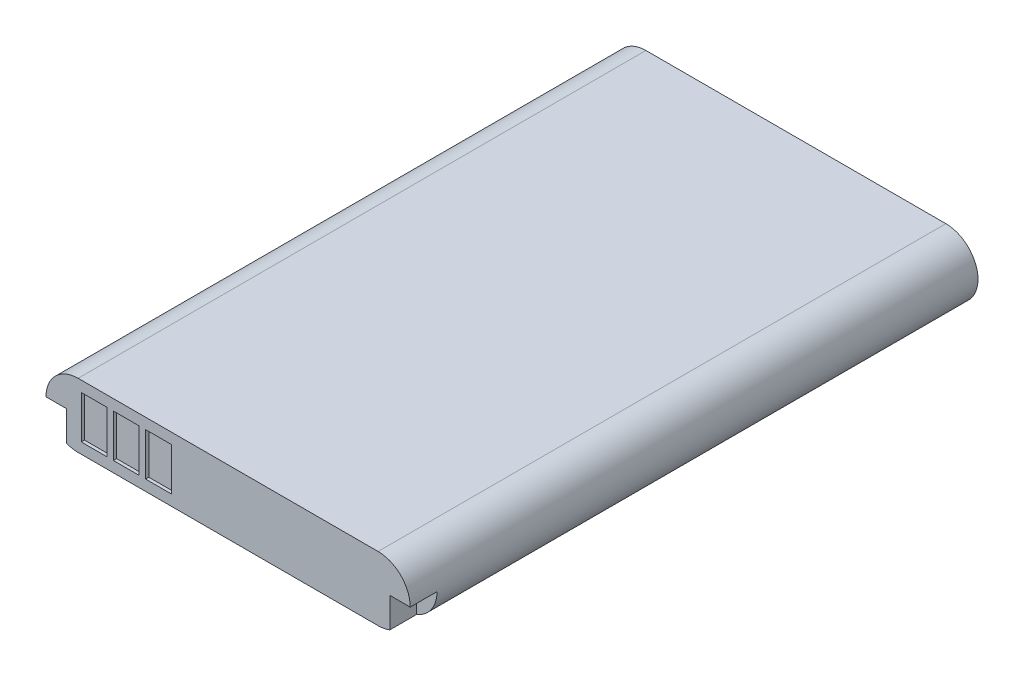
ISO-10303-21;
HEADER;
FILE_DESCRIPTION(('STEP AP214'),'2;1');
FILE_NAME('part.step','',(''),(''),'','','');
FILE_SCHEMA(('AUTOMOTIVE_DESIGN { 1 0 10303 214 1 1 1 1 }'));
ENDSEC;
DATA;
#1=APPLICATION_CONTEXT('core data for automotive mechanical design processes');
#2=APPLICATION_PROTOCOL_DEFINITION('international standard','automotive_design',2000,#1);
#3=PRODUCT_CONTEXT('',#1,'mechanical');
#4=PRODUCT('Part','Part','',(#3));
#5=PRODUCT_RELATED_PRODUCT_CATEGORY('part','',(#4));
#6=PRODUCT_DEFINITION_FORMATION('','',#4);
#7=PRODUCT_DEFINITION_CONTEXT('part definition',#1,'design');
#8=PRODUCT_DEFINITION('design','',#6,#7);
#9=PRODUCT_DEFINITION_SHAPE('','',#8);
#10=(LENGTH_UNIT() NAMED_UNIT(*) SI_UNIT(.MILLI.,.METRE.));
#11=(NAMED_UNIT(*) PLANE_ANGLE_UNIT() SI_UNIT($,.RADIAN.));
#12=(NAMED_UNIT(*) SI_UNIT($,.STERADIAN.) SOLID_ANGLE_UNIT());
#13=UNCERTAINTY_MEASURE_WITH_UNIT(LENGTH_MEASURE(1.E-05),#10,'distance_accuracy_value','');
#14=(GEOMETRIC_REPRESENTATION_CONTEXT(3) GLOBAL_UNCERTAINTY_ASSIGNED_CONTEXT((#13)) GLOBAL_UNIT_ASSIGNED_CONTEXT((#10,
#11,#12)) REPRESENTATION_CONTEXT('',''));
#15=CARTESIAN_POINT('',(0.,0.,0.));
#16=DIRECTION('',(0.,0.,1.));
#17=DIRECTION('',(1.,0.,0.));
#18=AXIS2_PLACEMENT_3D('',#15,#16,#17);
#19=CARTESIAN_POINT('',(-14.,0.,53.));
#20=DIRECTION('',(0.,0.,-1.));
#21=DIRECTION('',(-1.,0.,0.));
#22=AXIS2_PLACEMENT_3D('',#19,#20,#21);
#23=CYLINDRICAL_SURFACE('',#22,3.);
#24=CARTESIAN_POINT('',(-14.,0.,50.5));
#25=DIRECTION('',(0.,0.,1.));
#26=DIRECTION('',(1.,0.,0.));
#27=AXIS2_PLACEMENT_3D('',#24,#25,#26);
#28=CIRCLE('',#27,3.);
#29=CARTESIAN_POINT('',(-17.,0.,50.5));
#30=VERTEX_POINT('',#29);
#31=CARTESIAN_POINT('',(-15.1,-2.79105714739057,50.5));
#32=VERTEX_POINT('',#31);
#33=EDGE_CURVE('E349',#30,#32,#28,.T.);
#34=ORIENTED_EDGE('',*,*,#33,.F.);
#35=DIRECTION('',(0.,0.,-1.));
#36=VECTOR('',#35,1.);
#37=CARTESIAN_POINT('',(-17.,0.,53.));
#38=LINE('',#37,#36);
#39=CARTESIAN_POINT('',(-17.,0.,53.));
#40=VERTEX_POINT('',#39);
#41=EDGE_CURVE('E215',#30,#40,#38,.F.);
#42=ORIENTED_EDGE('',*,*,#41,.T.);
#43=CARTESIAN_POINT('',(-14.,0.,53.));
#44=DIRECTION('',(0.,0.,1.));
#45=DIRECTION('',(1.,0.,0.));
#46=AXIS2_PLACEMENT_3D('',#43,#44,#45);
#47=CIRCLE('',#46,3.);
#48=CARTESIAN_POINT('',(-14.,3.,53.));
#49=VERTEX_POINT('',#48);
#50=EDGE_CURVE('E315',#49,#40,#47,.T.);
#51=ORIENTED_EDGE('',*,*,#50,.F.);
#52=DIRECTION('',(0.,0.,-1.));
#53=VECTOR('',#52,1.);
#54=CARTESIAN_POINT('',(-14.,3.,53.));
#55=LINE('',#54,#53);
#56=CARTESIAN_POINT('',(-14.,3.,0.));
#57=VERTEX_POINT('',#56);
#58=EDGE_CURVE('E327',#49,#57,#55,.T.);
#59=ORIENTED_EDGE('',*,*,#58,.T.);
#60=CARTESIAN_POINT('',(-14.,0.,0.));
#61=DIRECTION('',(0.,0.,1.));
#62=DIRECTION('',(1.,0.,0.));
#63=AXIS2_PLACEMENT_3D('',#60,#61,#62);
#64=CIRCLE('',#63,3.);
#65=CARTESIAN_POINT('',(-14.,-3.,0.));
#66=VERTEX_POINT('',#65);
#67=EDGE_CURVE('E308',#57,#66,#64,.T.);
#68=ORIENTED_EDGE('',*,*,#67,.T.);
#69=DIRECTION('',(0.,0.,-1.));
#70=VECTOR('',#69,1.);
#71=CARTESIAN_POINT('',(-14.,-3.,53.));
#72=LINE('',#71,#70);
#73=CARTESIAN_POINT('',(-14.,-3.,53.));
#74=VERTEX_POINT('',#73);
#75=EDGE_CURVE('E344',#74,#66,#72,.T.);
#76=ORIENTED_EDGE('',*,*,#75,.F.);
#77=CARTESIAN_POINT('',(-15.1,-2.79105714739057,53.));
#78=VERTEX_POINT('',#77);
#79=EDGE_CURVE('E319',#78,#74,#47,.T.);
#80=ORIENTED_EDGE('',*,*,#79,.F.);
#81=DIRECTION('',(0.,0.,-1.));
#82=VECTOR('',#81,1.);
#83=CARTESIAN_POINT('',(-15.1,-2.79105714739057,53.));
#84=LINE('',#83,#82);
#85=EDGE_CURVE('E56',#78,#32,#84,.T.);
#86=ORIENTED_EDGE('',*,*,#85,.T.);
#87=EDGE_LOOP('',(#34,#42,#51,#59,#68,#76,#80,#86));
#88=FACE_BOUND('',#87,.T.);
#89=ADVANCED_FACE('F34',(#88),#23,.T.);
#90=CARTESIAN_POINT('',(-14.,-3.,53.));
#91=DIRECTION('',(0.,1.,0.));
#92=DIRECTION('',(0.,0.,1.));
#93=AXIS2_PLACEMENT_3D('',#90,#91,#92);
#94=PLANE('',#93);
#95=DIRECTION('',(1.,0.,0.));
#96=VECTOR('',#95,1.);
#97=CARTESIAN_POINT('',(-14.,-3.,0.));
#98=LINE('',#97,#96);
#99=CARTESIAN_POINT('',(14.,-3.,0.));
#100=VERTEX_POINT('',#99);
#101=EDGE_CURVE('E330',#66,#100,#98,.T.);
#102=ORIENTED_EDGE('',*,*,#101,.T.);
#103=DIRECTION('',(0.,0.,-1.));
#104=VECTOR('',#103,1.);
#105=CARTESIAN_POINT('',(14.,-3.,53.));
#106=LINE('',#105,#104);
#107=CARTESIAN_POINT('',(14.,-3.,53.));
#108=VERTEX_POINT('',#107);
#109=EDGE_CURVE('E341',#108,#100,#106,.T.);
#110=ORIENTED_EDGE('',*,*,#109,.F.);
#111=DIRECTION('',(1.,0.,0.));
#112=VECTOR('',#111,1.);
#113=CARTESIAN_POINT('',(-14.,-3.,53.));
#114=LINE('',#113,#112);
#115=EDGE_CURVE('E318',#74,#108,#114,.T.);
#116=ORIENTED_EDGE('',*,*,#115,.F.);
#117=ORIENTED_EDGE('',*,*,#75,.T.);
#118=EDGE_LOOP('',(#102,#110,#116,#117));
#119=FACE_BOUND('',#118,.T.);
#120=ADVANCED_FACE('F366',(#119),#94,.F.);
#121=CARTESIAN_POINT('',(14.,0.,53.));
#122=DIRECTION('',(0.,0.,-1.));
#123=DIRECTION('',(-1.,0.,0.));
#124=AXIS2_PLACEMENT_3D('',#121,#122,#123);
#125=CYLINDRICAL_SURFACE('',#124,3.);
#126=CARTESIAN_POINT('',(14.,0.,50.5));
#127=DIRECTION('',(0.,0.,-1.));
#128=DIRECTION('',(-1.,0.,0.));
#129=AXIS2_PLACEMENT_3D('',#126,#127,#128);
#130=CIRCLE('',#129,3.);
#131=CARTESIAN_POINT('',(17.,0.,50.5));
#132=VERTEX_POINT('',#131);
#133=CARTESIAN_POINT('',(15.1,-2.79105714739057,50.5));
#134=VERTEX_POINT('',#133);
#135=EDGE_CURVE('E11',#132,#134,#130,.T.);
#136=ORIENTED_EDGE('',*,*,#135,.T.);
#137=DIRECTION('',(0.,0.,-1.));
#138=VECTOR('',#137,1.);
#139=CARTESIAN_POINT('',(15.1,-2.79105714739057,53.));
#140=LINE('',#139,#138);
#141=CARTESIAN_POINT('',(15.1,-2.79105714739057,53.));
#142=VERTEX_POINT('',#141);
#143=EDGE_CURVE('E198',#134,#142,#140,.F.);
#144=ORIENTED_EDGE('',*,*,#143,.T.);
#145=CARTESIAN_POINT('',(14.,0.,53.));
#146=DIRECTION('',(0.,0.,1.));
#147=DIRECTION('',(1.,0.,0.));
#148=AXIS2_PLACEMENT_3D('',#145,#146,#147);
#149=CIRCLE('',#148,3.);
#150=EDGE_CURVE('E322',#108,#142,#149,.T.);
#151=ORIENTED_EDGE('',*,*,#150,.F.);
#152=ORIENTED_EDGE('',*,*,#109,.T.);
#153=CARTESIAN_POINT('',(14.,0.,0.));
#154=DIRECTION('',(0.,0.,1.));
#155=DIRECTION('',(1.,0.,0.));
#156=AXIS2_PLACEMENT_3D('',#153,#154,#155);
#157=CIRCLE('',#156,3.);
#158=CARTESIAN_POINT('',(14.,3.,0.));
#159=VERTEX_POINT('',#158);
#160=EDGE_CURVE('E332',#100,#159,#157,.T.);
#161=ORIENTED_EDGE('',*,*,#160,.T.);
#162=DIRECTION('',(0.,0.,-1.));
#163=VECTOR('',#162,1.);
#164=CARTESIAN_POINT('',(14.,3.,53.));
#165=LINE('',#164,#163);
#166=CARTESIAN_POINT('',(14.,3.,53.));
#167=VERTEX_POINT('',#166);
#168=EDGE_CURVE('E338',#167,#159,#165,.T.);
#169=ORIENTED_EDGE('',*,*,#168,.F.);
#170=CARTESIAN_POINT('',(17.,0.,53.));
#171=VERTEX_POINT('',#170);
#172=EDGE_CURVE('E321',#171,#167,#149,.T.);
#173=ORIENTED_EDGE('',*,*,#172,.F.);
#174=DIRECTION('',(0.,0.,-1.));
#175=VECTOR('',#174,1.);
#176=CARTESIAN_POINT('',(17.,0.,53.));
#177=LINE('',#176,#175);
#178=EDGE_CURVE('E48',#171,#132,#177,.T.);
#179=ORIENTED_EDGE('',*,*,#178,.T.);
#180=EDGE_LOOP('',(#136,#144,#151,#152,#161,#169,#173,#179));
#181=FACE_BOUND('',#180,.T.);
#182=ADVANCED_FACE('F370',(#181),#125,.T.);
#183=CARTESIAN_POINT('',(-14.,3.,53.));
#184=DIRECTION('',(0.,-1.,0.));
#185=DIRECTION('',(0.,0.,-1.));
#186=AXIS2_PLACEMENT_3D('',#183,#184,#185);
#187=PLANE('',#186);
#188=DIRECTION('',(-1.,0.,0.));
#189=VECTOR('',#188,1.);
#190=CARTESIAN_POINT('',(-14.,3.,0.));
#191=LINE('',#190,#189);
#192=EDGE_CURVE('E334',#159,#57,#191,.T.);
#193=ORIENTED_EDGE('',*,*,#192,.T.);
#194=ORIENTED_EDGE('',*,*,#58,.F.);
#195=DIRECTION('',(-1.,0.,0.));
#196=VECTOR('',#195,1.);
#197=CARTESIAN_POINT('',(-14.,3.,53.));
#198=LINE('',#197,#196);
#199=EDGE_CURVE('E325',#167,#49,#198,.T.);
#200=ORIENTED_EDGE('',*,*,#199,.F.);
#201=ORIENTED_EDGE('',*,*,#168,.T.);
#202=EDGE_LOOP('',(#193,#194,#200,#201));
#203=FACE_BOUND('',#202,.T.);
#204=ADVANCED_FACE('F377',(#203),#187,.F.);
#205=CARTESIAN_POINT('',(-14.,0.,53.));
#206=DIRECTION('',(0.,0.,1.));
#207=DIRECTION('',(1.,0.,0.));
#208=AXIS2_PLACEMENT_3D('',#205,#206,#207);
#209=PLANE('',#208);
#210=DIRECTION('',(0.,-1.,0.));
#211=VECTOR('',#210,1.);
#212=CARTESIAN_POINT('',(15.1,0.,53.));
#213=LINE('',#212,#211);
#214=CARTESIAN_POINT('',(15.1,0.,53.));
#215=VERTEX_POINT('',#214);
#216=EDGE_CURVE('E188',#215,#142,#213,.T.);
#217=ORIENTED_EDGE('',*,*,#216,.F.);
#218=DIRECTION('',(-1.,0.,0.));
#219=VECTOR('',#218,1.);
#220=CARTESIAN_POINT('',(-14.,0.,53.));
#221=LINE('',#220,#219);
#222=EDGE_CURVE('E41',#171,#215,#221,.T.);
#223=ORIENTED_EDGE('',*,*,#222,.F.);
#224=ORIENTED_EDGE('',*,*,#172,.T.);
#225=ORIENTED_EDGE('',*,*,#199,.T.);
#226=ORIENTED_EDGE('',*,*,#50,.T.);
#227=DIRECTION('',(-1.,0.,0.));
#228=VECTOR('',#227,1.);
#229=CARTESIAN_POINT('',(-19.1,0.,53.));
#230=LINE('',#229,#228);
#231=CARTESIAN_POINT('',(-15.1,0.,53.));
#232=VERTEX_POINT('',#231);
#233=EDGE_CURVE('E204',#232,#40,#230,.T.);
#234=ORIENTED_EDGE('',*,*,#233,.F.);
#235=DIRECTION('',(0.,1.,0.));
#236=VECTOR('',#235,1.);
#237=CARTESIAN_POINT('',(-15.1,0.,53.));
#238=LINE('',#237,#236);
#239=EDGE_CURVE('E347',#78,#232,#238,.T.);
#240=ORIENTED_EDGE('',*,*,#239,.F.);
#241=ORIENTED_EDGE('',*,*,#79,.T.);
#242=ORIENTED_EDGE('',*,*,#115,.T.);
#243=ORIENTED_EDGE('',*,*,#150,.T.);
#244=EDGE_LOOP('',(#217,#223,#224,#225,#226,#234,#240,#241,#242,#243));
#245=FACE_BOUND('',#244,.T.);
#246=DIRECTION('',(-1.,0.,0.));
#247=VECTOR('',#246,1.);
#248=CARTESIAN_POINT('',(-10.7,2.,53.));
#249=LINE('',#248,#247);
#250=CARTESIAN_POINT('',(-8.30000000000001,2.,53.));
#251=VERTEX_POINT('',#250);
#252=CARTESIAN_POINT('',(-10.7,2.,53.));
#253=VERTEX_POINT('',#252);
#254=EDGE_CURVE('E233',#251,#253,#249,.T.);
#255=ORIENTED_EDGE('',*,*,#254,.F.);
#256=DIRECTION('',(0.,1.,0.));
#257=VECTOR('',#256,1.);
#258=CARTESIAN_POINT('',(-8.30000000000001,2.,53.));
#259=LINE('',#258,#257);
#260=CARTESIAN_POINT('',(-8.30000000000001,-2.,53.));
#261=VERTEX_POINT('',#260);
#262=EDGE_CURVE('E223',#261,#251,#259,.T.);
#263=ORIENTED_EDGE('',*,*,#262,.F.);
#264=DIRECTION('',(1.,0.,0.));
#265=VECTOR('',#264,1.);
#266=CARTESIAN_POINT('',(-10.7,-2.,53.));
#267=LINE('',#266,#265);
#268=CARTESIAN_POINT('',(-10.7,-2.,53.));
#269=VERTEX_POINT('',#268);
#270=EDGE_CURVE('E239',#269,#261,#267,.T.);
#271=ORIENTED_EDGE('',*,*,#270,.F.);
#272=DIRECTION('',(0.,-1.,0.));
#273=VECTOR('',#272,1.);
#274=CARTESIAN_POINT('',(-10.7,2.,53.));
#275=LINE('',#274,#273);
#276=EDGE_CURVE('E235',#253,#269,#275,.T.);
#277=ORIENTED_EDGE('',*,*,#276,.F.);
#278=EDGE_LOOP('',(#255,#263,#271,#277));
#279=FACE_BOUND('',#278,.T.);
#280=DIRECTION('',(-1.,0.,0.));
#281=VECTOR('',#280,1.);
#282=CARTESIAN_POINT('',(-7.70000000000001,2.,53.));
#283=LINE('',#282,#281);
#284=CARTESIAN_POINT('',(-5.30000000000001,2.,53.));
#285=VERTEX_POINT('',#284);
#286=CARTESIAN_POINT('',(-7.70000000000001,2.,53.));
#287=VERTEX_POINT('',#286);
#288=EDGE_CURVE('E218',#285,#287,#283,.T.);
#289=ORIENTED_EDGE('',*,*,#288,.F.);
#290=DIRECTION('',(0.,1.,0.));
#291=VECTOR('',#290,1.);
#292=CARTESIAN_POINT('',(-5.30000000000001,2.,53.));
#293=LINE('',#292,#291);
#294=CARTESIAN_POINT('',(-5.30000000000001,-2.,53.));
#295=VERTEX_POINT('',#294);
#296=EDGE_CURVE('E257',#295,#285,#293,.T.);
#297=ORIENTED_EDGE('',*,*,#296,.F.);
#298=DIRECTION('',(1.,0.,0.));
#299=VECTOR('',#298,1.);
#300=CARTESIAN_POINT('',(-7.70000000000001,-2.,53.));
#301=LINE('',#300,#299);
#302=CARTESIAN_POINT('',(-7.70000000000001,-2.,53.));
#303=VERTEX_POINT('',#302);
#304=EDGE_CURVE('E271',#303,#295,#301,.T.);
#305=ORIENTED_EDGE('',*,*,#304,.F.);
#306=DIRECTION('',(0.,-1.,0.));
#307=VECTOR('',#306,1.);
#308=CARTESIAN_POINT('',(-7.70000000000001,2.,53.));
#309=LINE('',#308,#307);
#310=EDGE_CURVE('E268',#287,#303,#309,.T.);
#311=ORIENTED_EDGE('',*,*,#310,.F.);
#312=EDGE_LOOP('',(#289,#297,#305,#311));
#313=FACE_BOUND('',#312,.T.);
#314=DIRECTION('',(0.,-1.,0.));
#315=VECTOR('',#314,1.);
#316=CARTESIAN_POINT('',(-13.7,2.,53.));
#317=LINE('',#316,#315);
#318=CARTESIAN_POINT('',(-13.7,2.,53.));
#319=VERTEX_POINT('',#318);
#320=CARTESIAN_POINT('',(-13.7,-2.,53.));
#321=VERTEX_POINT('',#320);
#322=EDGE_CURVE('E246',#319,#321,#317,.T.);
#323=ORIENTED_EDGE('',*,*,#322,.F.);
#324=DIRECTION('',(-1.,0.,0.));
#325=VECTOR('',#324,1.);
#326=CARTESIAN_POINT('',(-13.7,2.,53.));
#327=LINE('',#326,#325);
#328=CARTESIAN_POINT('',(-11.3,2.,53.));
#329=VERTEX_POINT('',#328);
#330=EDGE_CURVE('E287',#329,#319,#327,.T.);
#331=ORIENTED_EDGE('',*,*,#330,.F.);
#332=DIRECTION('',(0.,1.,0.));
#333=VECTOR('',#332,1.);
#334=CARTESIAN_POINT('',(-11.3,2.,53.));
#335=LINE('',#334,#333);
#336=CARTESIAN_POINT('',(-11.3,-2.,53.));
#337=VERTEX_POINT('',#336);
#338=EDGE_CURVE('E301',#337,#329,#335,.T.);
#339=ORIENTED_EDGE('',*,*,#338,.F.);
#340=DIRECTION('',(1.,0.,0.));
#341=VECTOR('',#340,1.);
#342=CARTESIAN_POINT('',(-13.7,-2.,53.));
#343=LINE('',#342,#341);
#344=EDGE_CURVE('E298',#321,#337,#343,.T.);
#345=ORIENTED_EDGE('',*,*,#344,.F.);
#346=EDGE_LOOP('',(#323,#331,#339,#345));
#347=FACE_BOUND('',#346,.T.);
#348=ADVANCED_FACE('F361',(#245,#279,#313,#347),#209,.T.);
#349=CARTESIAN_POINT('',(-14.,0.,0.));
#350=DIRECTION('',(0.,0.,1.));
#351=DIRECTION('',(1.,0.,0.));
#352=AXIS2_PLACEMENT_3D('',#349,#350,#351);
#353=PLANE('',#352);
#354=ORIENTED_EDGE('',*,*,#67,.F.);
#355=ORIENTED_EDGE('',*,*,#192,.F.);
#356=ORIENTED_EDGE('',*,*,#160,.F.);
#357=ORIENTED_EDGE('',*,*,#101,.F.);
#358=EDGE_LOOP('',(#354,#355,#356,#357));
#359=FACE_BOUND('',#358,.T.);
#360=ADVANCED_FACE('F402',(#359),#353,.F.);
#361=CARTESIAN_POINT('',(-13.7,2.,52.7));
#362=DIRECTION('',(-1.,0.,0.));
#363=DIRECTION('',(0.,0.,1.));
#364=AXIS2_PLACEMENT_3D('',#361,#362,#363);
#365=PLANE('',#364);
#366=ORIENTED_EDGE('',*,*,#322,.T.);
#367=DIRECTION('',(0.,0.,1.));
#368=VECTOR('',#367,1.);
#369=CARTESIAN_POINT('',(-13.7,-2.,52.7));
#370=LINE('',#369,#368);
#371=CARTESIAN_POINT('',(-13.7,-2.,52.7));
#372=VERTEX_POINT('',#371);
#373=EDGE_CURVE('E296',#372,#321,#370,.T.);
#374=ORIENTED_EDGE('',*,*,#373,.F.);
#375=DIRECTION('',(0.,-1.,0.));
#376=VECTOR('',#375,1.);
#377=CARTESIAN_POINT('',(-13.7,2.,52.7));
#378=LINE('',#377,#376);
#379=CARTESIAN_POINT('',(-13.7,2.,52.7));
#380=VERTEX_POINT('',#379);
#381=EDGE_CURVE('E283',#380,#372,#378,.T.);
#382=ORIENTED_EDGE('',*,*,#381,.F.);
#383=DIRECTION('',(0.,0.,1.));
#384=VECTOR('',#383,1.);
#385=CARTESIAN_POINT('',(-13.7,2.,52.7));
#386=LINE('',#385,#384);
#387=EDGE_CURVE('E306',#380,#319,#386,.T.);
#388=ORIENTED_EDGE('',*,*,#387,.T.);
#389=EDGE_LOOP('',(#366,#374,#382,#388));
#390=FACE_BOUND('',#389,.T.);
#391=ADVANCED_FACE('F405',(#390),#365,.F.);
#392=CARTESIAN_POINT('',(-13.7,2.,52.7));
#393=DIRECTION('',(0.,1.,0.));
#394=DIRECTION('',(0.,0.,1.));
#395=AXIS2_PLACEMENT_3D('',#392,#393,#394);
#396=PLANE('',#395);
#397=ORIENTED_EDGE('',*,*,#330,.T.);
#398=ORIENTED_EDGE('',*,*,#387,.F.);
#399=DIRECTION('',(-1.,0.,0.));
#400=VECTOR('',#399,1.);
#401=CARTESIAN_POINT('',(-13.7,2.,52.7));
#402=LINE('',#401,#400);
#403=CARTESIAN_POINT('',(-11.3,2.,52.7));
#404=VERTEX_POINT('',#403);
#405=EDGE_CURVE('E293',#404,#380,#402,.T.);
#406=ORIENTED_EDGE('',*,*,#405,.F.);
#407=DIRECTION('',(0.,0.,1.));
#408=VECTOR('',#407,1.);
#409=CARTESIAN_POINT('',(-11.3,2.,52.7));
#410=LINE('',#409,#408);
#411=EDGE_CURVE('E309',#404,#329,#410,.T.);
#412=ORIENTED_EDGE('',*,*,#411,.T.);
#413=EDGE_LOOP('',(#397,#398,#406,#412));
#414=FACE_BOUND('',#413,.T.);
#415=ADVANCED_FACE('F411',(#414),#396,.F.);
#416=CARTESIAN_POINT('',(-11.3,2.,52.7));
#417=DIRECTION('',(1.,0.,0.));
#418=DIRECTION('',(0.,0.,-1.));
#419=AXIS2_PLACEMENT_3D('',#416,#417,#418);
#420=PLANE('',#419);
#421=ORIENTED_EDGE('',*,*,#338,.T.);
#422=ORIENTED_EDGE('',*,*,#411,.F.);
#423=DIRECTION('',(0.,1.,0.));
#424=VECTOR('',#423,1.);
#425=CARTESIAN_POINT('',(-11.3,2.,52.7));
#426=LINE('',#425,#424);
#427=CARTESIAN_POINT('',(-11.3,-2.,52.7));
#428=VERTEX_POINT('',#427);
#429=EDGE_CURVE('E290',#428,#404,#426,.T.);
#430=ORIENTED_EDGE('',*,*,#429,.F.);
#431=DIRECTION('',(0.,0.,1.));
#432=VECTOR('',#431,1.);
#433=CARTESIAN_POINT('',(-11.3,-2.,52.7));
#434=LINE('',#433,#432);
#435=EDGE_CURVE('E311',#428,#337,#434,.T.);
#436=ORIENTED_EDGE('',*,*,#435,.T.);
#437=EDGE_LOOP('',(#421,#422,#430,#436));
#438=FACE_BOUND('',#437,.T.);
#439=ADVANCED_FACE('F417',(#438),#420,.F.);
#440=CARTESIAN_POINT('',(-13.7,-2.,52.7));
#441=DIRECTION('',(0.,-1.,0.));
#442=DIRECTION('',(0.,0.,-1.));
#443=AXIS2_PLACEMENT_3D('',#440,#441,#442);
#444=PLANE('',#443);
#445=ORIENTED_EDGE('',*,*,#344,.T.);
#446=ORIENTED_EDGE('',*,*,#435,.F.);
#447=DIRECTION('',(1.,0.,0.));
#448=VECTOR('',#447,1.);
#449=CARTESIAN_POINT('',(-13.7,-2.,52.7));
#450=LINE('',#449,#448);
#451=EDGE_CURVE('E286',#372,#428,#450,.T.);
#452=ORIENTED_EDGE('',*,*,#451,.F.);
#453=ORIENTED_EDGE('',*,*,#373,.T.);
#454=EDGE_LOOP('',(#445,#446,#452,#453));
#455=FACE_BOUND('',#454,.T.);
#456=ADVANCED_FACE('F413',(#455),#444,.F.);
#457=CARTESIAN_POINT('',(0.,0.,52.7));
#458=DIRECTION('',(0.,0.,1.));
#459=DIRECTION('',(1.,0.,0.));
#460=AXIS2_PLACEMENT_3D('',#457,#458,#459);
#461=PLANE('',#460);
#462=ORIENTED_EDGE('',*,*,#381,.T.);
#463=ORIENTED_EDGE('',*,*,#451,.T.);
#464=ORIENTED_EDGE('',*,*,#429,.T.);
#465=ORIENTED_EDGE('',*,*,#405,.T.);
#466=EDGE_LOOP('',(#462,#463,#464,#465));
#467=FACE_BOUND('',#466,.T.);
#468=ADVANCED_FACE('F416',(#467),#461,.T.);
#469=CARTESIAN_POINT('',(-7.70000000000001,2.,52.7));
#470=DIRECTION('',(0.,1.,0.));
#471=DIRECTION('',(0.,0.,1.));
#472=AXIS2_PLACEMENT_3D('',#469,#470,#471);
#473=PLANE('',#472);
#474=ORIENTED_EDGE('',*,*,#288,.T.);
#475=DIRECTION('',(0.,0.,1.));
#476=VECTOR('',#475,1.);
#477=CARTESIAN_POINT('',(-7.70000000000001,2.,52.7));
#478=LINE('',#477,#476);
#479=CARTESIAN_POINT('',(-7.70000000000001,2.,52.7));
#480=VERTEX_POINT('',#479);
#481=EDGE_CURVE('E266',#480,#287,#478,.T.);
#482=ORIENTED_EDGE('',*,*,#481,.F.);
#483=DIRECTION('',(-1.,0.,0.));
#484=VECTOR('',#483,1.);
#485=CARTESIAN_POINT('',(-7.70000000000001,2.,52.7));
#486=LINE('',#485,#484);
#487=CARTESIAN_POINT('',(-5.30000000000001,2.,52.7));
#488=VERTEX_POINT('',#487);
#489=EDGE_CURVE('E253',#488,#480,#486,.T.);
#490=ORIENTED_EDGE('',*,*,#489,.F.);
#491=DIRECTION('',(0.,0.,1.));
#492=VECTOR('',#491,1.);
#493=CARTESIAN_POINT('',(-5.30000000000001,2.,52.7));
#494=LINE('',#493,#492);
#495=EDGE_CURVE('E236',#488,#285,#494,.T.);
#496=ORIENTED_EDGE('',*,*,#495,.T.);
#497=EDGE_LOOP('',(#474,#482,#490,#496));
#498=FACE_BOUND('',#497,.T.);
#499=ADVANCED_FACE('F427',(#498),#473,.F.);
#500=CARTESIAN_POINT('',(-5.30000000000001,2.,52.7));
#501=DIRECTION('',(1.,0.,0.));
#502=DIRECTION('',(0.,0.,-1.));
#503=AXIS2_PLACEMENT_3D('',#500,#501,#502);
#504=PLANE('',#503);
#505=ORIENTED_EDGE('',*,*,#296,.T.);
#506=ORIENTED_EDGE('',*,*,#495,.F.);
#507=DIRECTION('',(0.,1.,0.));
#508=VECTOR('',#507,1.);
#509=CARTESIAN_POINT('',(-5.30000000000001,2.,52.7));
#510=LINE('',#509,#508);
#511=CARTESIAN_POINT('',(-5.30000000000001,-2.,52.7));
#512=VERTEX_POINT('',#511);
#513=EDGE_CURVE('E263',#512,#488,#510,.T.);
#514=ORIENTED_EDGE('',*,*,#513,.F.);
#515=DIRECTION('',(0.,0.,1.));
#516=VECTOR('',#515,1.);
#517=CARTESIAN_POINT('',(-5.30000000000001,-2.,52.7));
#518=LINE('',#517,#516);
#519=EDGE_CURVE('E277',#512,#295,#518,.T.);
#520=ORIENTED_EDGE('',*,*,#519,.T.);
#521=EDGE_LOOP('',(#505,#506,#514,#520));
#522=FACE_BOUND('',#521,.T.);
#523=ADVANCED_FACE('F431',(#522),#504,.F.);
#524=CARTESIAN_POINT('',(-7.70000000000001,-2.,52.7));
#525=DIRECTION('',(0.,-1.,0.));
#526=DIRECTION('',(0.,0.,-1.));
#527=AXIS2_PLACEMENT_3D('',#524,#525,#526);
#528=PLANE('',#527);
#529=ORIENTED_EDGE('',*,*,#304,.T.);
#530=ORIENTED_EDGE('',*,*,#519,.F.);
#531=DIRECTION('',(1.,0.,0.));
#532=VECTOR('',#531,1.);
#533=CARTESIAN_POINT('',(-7.70000000000001,-2.,52.7));
#534=LINE('',#533,#532);
#535=CARTESIAN_POINT('',(-7.70000000000001,-2.,52.7));
#536=VERTEX_POINT('',#535);
#537=EDGE_CURVE('E260',#536,#512,#534,.T.);
#538=ORIENTED_EDGE('',*,*,#537,.F.);
#539=DIRECTION('',(0.,0.,1.));
#540=VECTOR('',#539,1.);
#541=CARTESIAN_POINT('',(-7.70000000000001,-2.,52.7));
#542=LINE('',#541,#540);
#543=EDGE_CURVE('E279',#536,#303,#542,.T.);
#544=ORIENTED_EDGE('',*,*,#543,.T.);
#545=EDGE_LOOP('',(#529,#530,#538,#544));
#546=FACE_BOUND('',#545,.T.);
#547=ADVANCED_FACE('F437',(#546),#528,.F.);
#548=CARTESIAN_POINT('',(-7.70000000000001,2.,52.7));
#549=DIRECTION('',(-1.,0.,0.));
#550=DIRECTION('',(0.,0.,1.));
#551=AXIS2_PLACEMENT_3D('',#548,#549,#550);
#552=PLANE('',#551);
#553=ORIENTED_EDGE('',*,*,#310,.T.);
#554=ORIENTED_EDGE('',*,*,#543,.F.);
#555=DIRECTION('',(0.,-1.,0.));
#556=VECTOR('',#555,1.);
#557=CARTESIAN_POINT('',(-7.70000000000001,2.,52.7));
#558=LINE('',#557,#556);
#559=EDGE_CURVE('E256',#480,#536,#558,.T.);
#560=ORIENTED_EDGE('',*,*,#559,.F.);
#561=ORIENTED_EDGE('',*,*,#481,.T.);
#562=EDGE_LOOP('',(#553,#554,#560,#561));
#563=FACE_BOUND('',#562,.T.);
#564=ADVANCED_FACE('F433',(#563),#552,.F.);
#565=CARTESIAN_POINT('',(0.,0.,52.7));
#566=DIRECTION('',(0.,0.,-1.));
#567=DIRECTION('',(-1.,0.,0.));
#568=AXIS2_PLACEMENT_3D('',#565,#566,#567);
#569=PLANE('',#568);
#570=ORIENTED_EDGE('',*,*,#489,.T.);
#571=ORIENTED_EDGE('',*,*,#559,.T.);
#572=ORIENTED_EDGE('',*,*,#537,.T.);
#573=ORIENTED_EDGE('',*,*,#513,.T.);
#574=EDGE_LOOP('',(#570,#571,#572,#573));
#575=FACE_BOUND('',#574,.T.);
#576=ADVANCED_FACE('F436',(#575),#569,.F.);
#577=CARTESIAN_POINT('',(-10.7,2.,52.7));
#578=DIRECTION('',(0.,1.,0.));
#579=DIRECTION('',(0.,0.,1.));
#580=AXIS2_PLACEMENT_3D('',#577,#578,#579);
#581=PLANE('',#580);
#582=ORIENTED_EDGE('',*,*,#254,.T.);
#583=DIRECTION('',(0.,0.,1.));
#584=VECTOR('',#583,1.);
#585=CARTESIAN_POINT('',(-10.7,2.,52.7));
#586=LINE('',#585,#584);
#587=CARTESIAN_POINT('',(-10.7,2.,52.7));
#588=VERTEX_POINT('',#587);
#589=EDGE_CURVE('E232',#588,#253,#586,.T.);
#590=ORIENTED_EDGE('',*,*,#589,.F.);
#591=DIRECTION('',(-1.,0.,0.));
#592=VECTOR('',#591,1.);
#593=CARTESIAN_POINT('',(-10.7,2.,52.7));
#594=LINE('',#593,#592);
#595=CARTESIAN_POINT('',(-8.30000000000001,2.,52.7));
#596=VERTEX_POINT('',#595);
#597=EDGE_CURVE('E219',#596,#588,#594,.T.);
#598=ORIENTED_EDGE('',*,*,#597,.F.);
#599=DIRECTION('',(0.,0.,1.));
#600=VECTOR('',#599,1.);
#601=CARTESIAN_POINT('',(-8.30000000000001,2.,52.7));
#602=LINE('',#601,#600);
#603=EDGE_CURVE('E244',#596,#251,#602,.T.);
#604=ORIENTED_EDGE('',*,*,#603,.T.);
#605=EDGE_LOOP('',(#582,#590,#598,#604));
#606=FACE_BOUND('',#605,.T.);
#607=ADVANCED_FACE('F447',(#606),#581,.F.);
#608=CARTESIAN_POINT('',(-8.30000000000001,2.,52.7));
#609=DIRECTION('',(1.,0.,0.));
#610=DIRECTION('',(0.,0.,-1.));
#611=AXIS2_PLACEMENT_3D('',#608,#609,#610);
#612=PLANE('',#611);
#613=ORIENTED_EDGE('',*,*,#262,.T.);
#614=ORIENTED_EDGE('',*,*,#603,.F.);
#615=DIRECTION('',(0.,1.,0.));
#616=VECTOR('',#615,1.);
#617=CARTESIAN_POINT('',(-8.30000000000001,2.,52.7));
#618=LINE('',#617,#616);
#619=CARTESIAN_POINT('',(-8.30000000000001,-2.,52.7));
#620=VERTEX_POINT('',#619);
#621=EDGE_CURVE('E229',#620,#596,#618,.T.);
#622=ORIENTED_EDGE('',*,*,#621,.F.);
#623=DIRECTION('',(0.,0.,1.));
#624=VECTOR('',#623,1.);
#625=CARTESIAN_POINT('',(-8.30000000000001,-2.,52.7));
#626=LINE('',#625,#624);
#627=EDGE_CURVE('E247',#620,#261,#626,.T.);
#628=ORIENTED_EDGE('',*,*,#627,.T.);
#629=EDGE_LOOP('',(#613,#614,#622,#628));
#630=FACE_BOUND('',#629,.T.);
#631=ADVANCED_FACE('F451',(#630),#612,.F.);
#632=CARTESIAN_POINT('',(-10.7,-2.,52.7));
#633=DIRECTION('',(0.,-1.,0.));
#634=DIRECTION('',(0.,0.,-1.));
#635=AXIS2_PLACEMENT_3D('',#632,#633,#634);
#636=PLANE('',#635);
#637=ORIENTED_EDGE('',*,*,#270,.T.);
#638=ORIENTED_EDGE('',*,*,#627,.F.);
#639=DIRECTION('',(1.,0.,0.));
#640=VECTOR('',#639,1.);
#641=CARTESIAN_POINT('',(-10.7,-2.,52.7));
#642=LINE('',#641,#640);
#643=CARTESIAN_POINT('',(-10.7,-2.,52.7));
#644=VERTEX_POINT('',#643);
#645=EDGE_CURVE('E226',#644,#620,#642,.T.);
#646=ORIENTED_EDGE('',*,*,#645,.F.);
#647=DIRECTION('',(0.,0.,1.));
#648=VECTOR('',#647,1.);
#649=CARTESIAN_POINT('',(-10.7,-2.,52.7));
#650=LINE('',#649,#648);
#651=EDGE_CURVE('E249',#644,#269,#650,.T.);
#652=ORIENTED_EDGE('',*,*,#651,.T.);
#653=EDGE_LOOP('',(#637,#638,#646,#652));
#654=FACE_BOUND('',#653,.T.);
#655=ADVANCED_FACE('F456',(#654),#636,.F.);
#656=CARTESIAN_POINT('',(-10.7,2.,52.7));
#657=DIRECTION('',(-1.,0.,0.));
#658=DIRECTION('',(0.,0.,1.));
#659=AXIS2_PLACEMENT_3D('',#656,#657,#658);
#660=PLANE('',#659);
#661=ORIENTED_EDGE('',*,*,#276,.T.);
#662=ORIENTED_EDGE('',*,*,#651,.F.);
#663=DIRECTION('',(0.,-1.,0.));
#664=VECTOR('',#663,1.);
#665=CARTESIAN_POINT('',(-10.7,2.,52.7));
#666=LINE('',#665,#664);
#667=EDGE_CURVE('E222',#588,#644,#666,.T.);
#668=ORIENTED_EDGE('',*,*,#667,.F.);
#669=ORIENTED_EDGE('',*,*,#589,.T.);
#670=EDGE_LOOP('',(#661,#662,#668,#669));
#671=FACE_BOUND('',#670,.T.);
#672=ADVANCED_FACE('F453',(#671),#660,.F.);
#673=CARTESIAN_POINT('',(0.,0.,52.7));
#674=DIRECTION('',(0.,0.,-1.));
#675=DIRECTION('',(-1.,0.,0.));
#676=AXIS2_PLACEMENT_3D('',#673,#674,#675);
#677=PLANE('',#676);
#678=ORIENTED_EDGE('',*,*,#597,.T.);
#679=ORIENTED_EDGE('',*,*,#667,.T.);
#680=ORIENTED_EDGE('',*,*,#645,.T.);
#681=ORIENTED_EDGE('',*,*,#621,.T.);
#682=EDGE_LOOP('',(#678,#679,#680,#681));
#683=FACE_BOUND('',#682,.T.);
#684=ADVANCED_FACE('F389',(#683),#677,.F.);
#685=CARTESIAN_POINT('',(0.,0.,50.5));
#686=DIRECTION('',(0.,0.,1.));
#687=DIRECTION('',(1.,0.,0.));
#688=AXIS2_PLACEMENT_3D('',#685,#686,#687);
#689=PLANE('',#688);
#690=ORIENTED_EDGE('',*,*,#33,.T.);
#691=DIRECTION('',(0.,1.,0.));
#692=VECTOR('',#691,1.);
#693=CARTESIAN_POINT('',(-15.1,0.,50.5));
#694=LINE('',#693,#692);
#695=CARTESIAN_POINT('',(-15.1,0.,50.5));
#696=VERTEX_POINT('',#695);
#697=EDGE_CURVE('E205',#32,#696,#694,.T.);
#698=ORIENTED_EDGE('',*,*,#697,.T.);
#699=DIRECTION('',(-1.,0.,0.));
#700=VECTOR('',#699,1.);
#701=CARTESIAN_POINT('',(-19.1,0.,50.5));
#702=LINE('',#701,#700);
#703=EDGE_CURVE('E207',#696,#30,#702,.T.);
#704=ORIENTED_EDGE('',*,*,#703,.T.);
#705=EDGE_LOOP('',(#690,#698,#704));
#706=FACE_BOUND('',#705,.T.);
#707=ADVANCED_FACE('F352',(#706),#689,.T.);
#708=CARTESIAN_POINT('',(-19.1,0.,50.5));
#709=DIRECTION('',(0.,1.,0.));
#710=DIRECTION('',(0.,0.,1.));
#711=AXIS2_PLACEMENT_3D('',#708,#709,#710);
#712=PLANE('',#711);
#713=ORIENTED_EDGE('',*,*,#703,.F.);
#714=DIRECTION('',(0.,0.,1.));
#715=VECTOR('',#714,1.);
#716=CARTESIAN_POINT('',(-15.1,0.,50.5));
#717=LINE('',#716,#715);
#718=EDGE_CURVE('E210',#696,#232,#717,.T.);
#719=ORIENTED_EDGE('',*,*,#718,.T.);
#720=ORIENTED_EDGE('',*,*,#233,.T.);
#721=ORIENTED_EDGE('',*,*,#41,.F.);
#722=EDGE_LOOP('',(#713,#719,#720,#721));
#723=FACE_BOUND('',#722,.T.);
#724=ADVANCED_FACE('F381',(#723),#712,.F.);
#725=CARTESIAN_POINT('',(-15.1,0.,50.5));
#726=DIRECTION('',(1.,0.,0.));
#727=DIRECTION('',(0.,0.,-1.));
#728=AXIS2_PLACEMENT_3D('',#725,#726,#727);
#729=PLANE('',#728);
#730=ORIENTED_EDGE('',*,*,#239,.T.);
#731=ORIENTED_EDGE('',*,*,#718,.F.);
#732=ORIENTED_EDGE('',*,*,#697,.F.);
#733=ORIENTED_EDGE('',*,*,#85,.F.);
#734=EDGE_LOOP('',(#730,#731,#732,#733));
#735=FACE_BOUND('',#734,.T.);
#736=ADVANCED_FACE('F356',(#735),#729,.F.);
#737=CARTESIAN_POINT('',(0.,0.,50.5));
#738=DIRECTION('',(0.,0.,-1.));
#739=DIRECTION('',(-1.,0.,0.));
#740=AXIS2_PLACEMENT_3D('',#737,#738,#739);
#741=PLANE('',#740);
#742=DIRECTION('',(-1.,0.,0.));
#743=VECTOR('',#742,1.);
#744=CARTESIAN_POINT('',(19.1,0.,50.5));
#745=LINE('',#744,#743);
#746=CARTESIAN_POINT('',(15.1,0.,50.5));
#747=VERTEX_POINT('',#746);
#748=EDGE_CURVE('E183',#132,#747,#745,.T.);
#749=ORIENTED_EDGE('',*,*,#748,.T.);
#750=DIRECTION('',(0.,-1.,0.));
#751=VECTOR('',#750,1.);
#752=CARTESIAN_POINT('',(15.1,0.,50.5));
#753=LINE('',#752,#751);
#754=EDGE_CURVE('E187',#747,#134,#753,.T.);
#755=ORIENTED_EDGE('',*,*,#754,.T.);
#756=ORIENTED_EDGE('',*,*,#135,.F.);
#757=EDGE_LOOP('',(#749,#755,#756));
#758=FACE_BOUND('',#757,.T.);
#759=ADVANCED_FACE('F185',(#758),#741,.F.);
#760=CARTESIAN_POINT('',(15.1,0.,50.5));
#761=DIRECTION('',(-1.,0.,0.));
#762=DIRECTION('',(0.,0.,1.));
#763=AXIS2_PLACEMENT_3D('',#760,#761,#762);
#764=PLANE('',#763);
#765=ORIENTED_EDGE('',*,*,#754,.F.);
#766=DIRECTION('',(0.,0.,1.));
#767=VECTOR('',#766,1.);
#768=CARTESIAN_POINT('',(15.1,0.,50.5));
#769=LINE('',#768,#767);
#770=EDGE_CURVE('E191',#747,#215,#769,.T.);
#771=ORIENTED_EDGE('',*,*,#770,.T.);
#772=ORIENTED_EDGE('',*,*,#216,.T.);
#773=ORIENTED_EDGE('',*,*,#143,.F.);
#774=EDGE_LOOP('',(#765,#771,#772,#773));
#775=FACE_BOUND('',#774,.T.);
#776=ADVANCED_FACE('F196',(#775),#764,.F.);
#777=CARTESIAN_POINT('',(19.1,0.,50.5));
#778=DIRECTION('',(0.,1.,0.));
#779=DIRECTION('',(-1.,0.,0.));
#780=AXIS2_PLACEMENT_3D('',#777,#778,#779);
#781=PLANE('',#780);
#782=ORIENTED_EDGE('',*,*,#222,.T.);
#783=ORIENTED_EDGE('',*,*,#770,.F.);
#784=ORIENTED_EDGE('',*,*,#748,.F.);
#785=ORIENTED_EDGE('',*,*,#178,.F.);
#786=EDGE_LOOP('',(#782,#783,#784,#785));
#787=FACE_BOUND('',#786,.T.);
#788=ADVANCED_FACE('F192',(#787),#781,.F.);
#789=CLOSED_SHELL('',(#89,#120,#182,#204,#348,#360,#391,#415,#439,#456,#468,#499,#523,#547,#564,
#576,#607,#631,#655,#672,#684,#707,#724,#736,#759,#776,#788));
#790=MANIFOLD_SOLID_BREP('B2',#789);
#791=ADVANCED_BREP_SHAPE_REPRESENTATION('',(#18,#790),#14);
#792=SHAPE_DEFINITION_REPRESENTATION(#9,#791);
ENDSEC;
END-ISO-10303-21;
